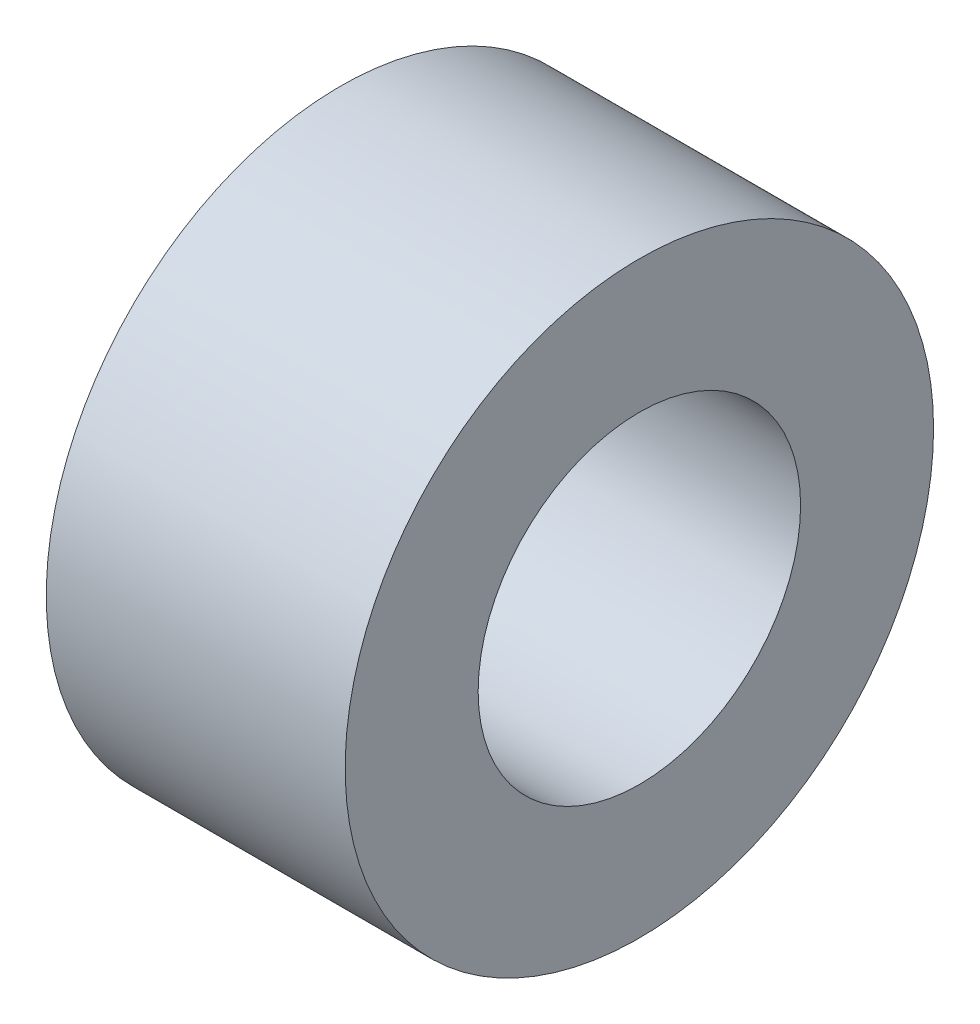
ISO-10303-21;
HEADER;
FILE_DESCRIPTION(('STEP AP214'),'2;1');
FILE_NAME('part.step','',(''),(''),'','','');
FILE_SCHEMA(('AUTOMOTIVE_DESIGN { 1 0 10303 214 1 1 1 1 }'));
ENDSEC;
DATA;
#1=APPLICATION_CONTEXT('core data for automotive mechanical design processes');
#2=APPLICATION_PROTOCOL_DEFINITION('international standard','automotive_design',2000,#1);
#3=PRODUCT_CONTEXT('',#1,'mechanical');
#4=PRODUCT('Part','Part','',(#3));
#5=PRODUCT_RELATED_PRODUCT_CATEGORY('part','',(#4));
#6=PRODUCT_DEFINITION_FORMATION('','',#4);
#7=PRODUCT_DEFINITION_CONTEXT('part definition',#1,'design');
#8=PRODUCT_DEFINITION('design','',#6,#7);
#9=PRODUCT_DEFINITION_SHAPE('','',#8);
#10=(LENGTH_UNIT() NAMED_UNIT(*) SI_UNIT(.MILLI.,.METRE.));
#11=(NAMED_UNIT(*) PLANE_ANGLE_UNIT() SI_UNIT($,.RADIAN.));
#12=(NAMED_UNIT(*) SI_UNIT($,.STERADIAN.) SOLID_ANGLE_UNIT());
#13=UNCERTAINTY_MEASURE_WITH_UNIT(LENGTH_MEASURE(1.E-05),#10,'distance_accuracy_value','');
#14=(GEOMETRIC_REPRESENTATION_CONTEXT(3) GLOBAL_UNCERTAINTY_ASSIGNED_CONTEXT((#13)) GLOBAL_UNIT_ASSIGNED_CONTEXT((#10,
#11,#12)) REPRESENTATION_CONTEXT('',''));
#15=CARTESIAN_POINT('',(0.,0.,0.));
#16=DIRECTION('',(0.,0.,1.));
#17=DIRECTION('',(1.,0.,0.));
#18=AXIS2_PLACEMENT_3D('',#15,#16,#17);
#19=CARTESIAN_POINT('',(6.35,0.,0.));
#20=DIRECTION('',(1.,0.,0.));
#21=DIRECTION('',(0.,0.,-1.));
#22=AXIS2_PLACEMENT_3D('',#19,#20,#21);
#23=PLANE('',#22);
#24=CARTESIAN_POINT('',(6.35,0.,0.));
#25=DIRECTION('',(1.,0.,0.));
#26=DIRECTION('',(0.,0.,-1.));
#27=AXIS2_PLACEMENT_3D('',#24,#25,#26);
#28=CIRCLE('',#27,6.25);
#29=CARTESIAN_POINT('',(6.35,0.,-6.25));
#30=VERTEX_POINT('',#29);
#31=EDGE_CURVE('E10',#30,#30,#28,.T.);
#32=ORIENTED_EDGE('',*,*,#31,.T.);
#33=EDGE_LOOP('',(#32));
#34=FACE_BOUND('',#33,.T.);
#35=CARTESIAN_POINT('',(6.35,0.,0.));
#36=DIRECTION('',(1.,0.,0.));
#37=DIRECTION('',(0.,0.,-1.));
#38=AXIS2_PLACEMENT_3D('',#35,#36,#37);
#39=CIRCLE('',#38,3.425);
#40=CARTESIAN_POINT('',(6.35,0.,-3.425));
#41=VERTEX_POINT('',#40);
#42=EDGE_CURVE('E57',#41,#41,#39,.T.);
#43=ORIENTED_EDGE('',*,*,#42,.F.);
#44=EDGE_LOOP('',(#43));
#45=FACE_BOUND('',#44,.T.);
#46=ADVANCED_FACE('F43',(#34,#45),#23,.T.);
#47=CARTESIAN_POINT('',(0.,0.,0.));
#48=DIRECTION('',(1.,0.,0.));
#49=DIRECTION('',(0.,0.,-1.));
#50=AXIS2_PLACEMENT_3D('',#47,#48,#49);
#51=PLANE('',#50);
#52=CARTESIAN_POINT('',(0.,0.,0.));
#53=DIRECTION('',(1.,0.,0.));
#54=DIRECTION('',(0.,0.,-1.));
#55=AXIS2_PLACEMENT_3D('',#52,#53,#54);
#56=CIRCLE('',#55,6.25);
#57=CARTESIAN_POINT('',(0.,0.,-6.25));
#58=VERTEX_POINT('',#57);
#59=EDGE_CURVE('E50',#58,#58,#56,.T.);
#60=ORIENTED_EDGE('',*,*,#59,.F.);
#61=EDGE_LOOP('',(#60));
#62=FACE_BOUND('',#61,.T.);
#63=CARTESIAN_POINT('',(0.,0.,0.));
#64=DIRECTION('',(1.,0.,0.));
#65=DIRECTION('',(0.,0.,-1.));
#66=AXIS2_PLACEMENT_3D('',#63,#64,#65);
#67=CIRCLE('',#66,3.425);
#68=CARTESIAN_POINT('',(0.,0.,-3.425));
#69=VERTEX_POINT('',#68);
#70=EDGE_CURVE('E59',#69,#69,#67,.T.);
#71=ORIENTED_EDGE('',*,*,#70,.T.);
#72=EDGE_LOOP('',(#71));
#73=FACE_BOUND('',#72,.T.);
#74=ADVANCED_FACE('F67',(#62,#73),#51,.F.);
#75=CARTESIAN_POINT('',(6.35,0.,0.));
#76=DIRECTION('',(-1.,0.,0.));
#77=DIRECTION('',(0.,0.,1.));
#78=AXIS2_PLACEMENT_3D('',#75,#76,#77);
#79=CYLINDRICAL_SURFACE('',#78,6.25);
#80=ORIENTED_EDGE('',*,*,#31,.F.);
#81=EDGE_LOOP('',(#80));
#82=FACE_BOUND('',#81,.T.);
#83=ORIENTED_EDGE('',*,*,#59,.T.);
#84=EDGE_LOOP('',(#83));
#85=FACE_BOUND('',#84,.T.);
#86=ADVANCED_FACE('F44',(#82,#85),#79,.T.);
#87=CARTESIAN_POINT('',(6.35,0.,0.));
#88=DIRECTION('',(-1.,0.,0.));
#89=DIRECTION('',(0.,0.,1.));
#90=AXIS2_PLACEMENT_3D('',#87,#88,#89);
#91=CYLINDRICAL_SURFACE('',#90,3.425);
#92=ORIENTED_EDGE('',*,*,#42,.T.);
#93=EDGE_LOOP('',(#92));
#94=FACE_BOUND('',#93,.T.);
#95=ORIENTED_EDGE('',*,*,#70,.F.);
#96=EDGE_LOOP('',(#95));
#97=FACE_BOUND('',#96,.T.);
#98=ADVANCED_FACE('F69',(#94,#97),#91,.F.);
#99=CLOSED_SHELL('',(#46,#74,#86,#98));
#100=MANIFOLD_SOLID_BREP('B2',#99);
#101=ADVANCED_BREP_SHAPE_REPRESENTATION('',(#18,#100),#14);
#102=SHAPE_DEFINITION_REPRESENTATION(#9,#101);
ENDSEC;
END-ISO-10303-21;
